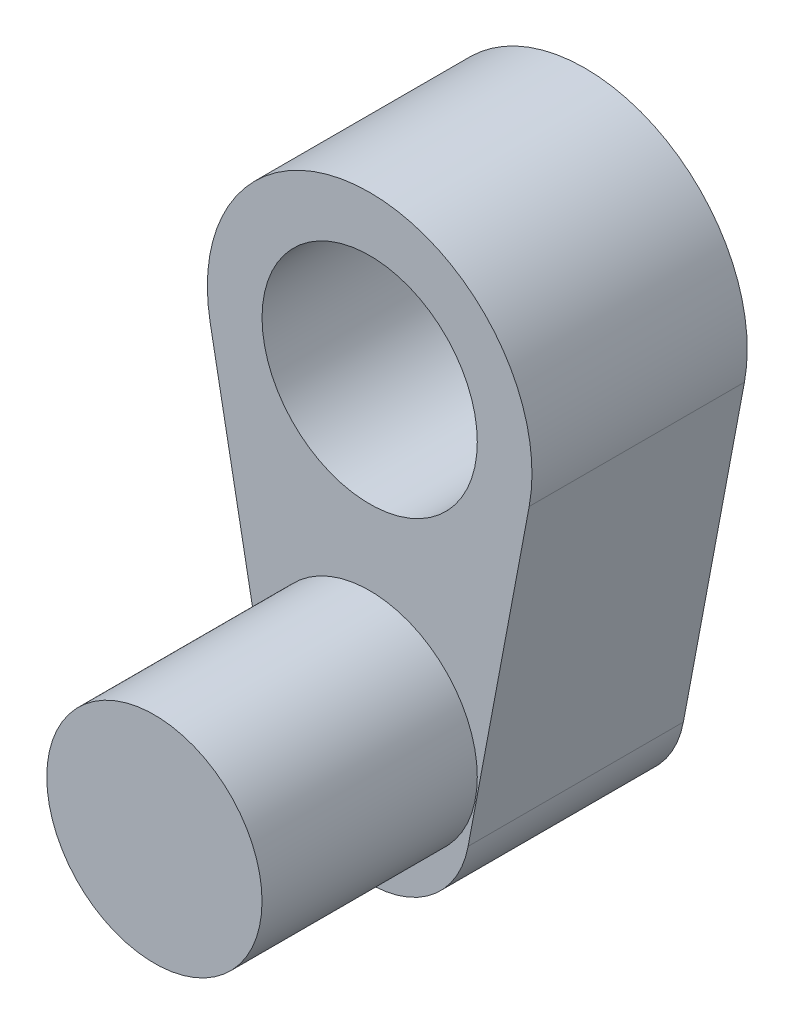
ISO-10303-21;
HEADER;
FILE_DESCRIPTION(('STEP AP214'),'2;1');
FILE_NAME('part.step','',(''),(''),'','','');
FILE_SCHEMA(('AUTOMOTIVE_DESIGN { 1 0 10303 214 1 1 1 1 }'));
ENDSEC;
DATA;
#1=APPLICATION_CONTEXT('core data for automotive mechanical design processes');
#2=APPLICATION_PROTOCOL_DEFINITION('international standard','automotive_design',2000,#1);
#3=PRODUCT_CONTEXT('',#1,'mechanical');
#4=PRODUCT('Part','Part','',(#3));
#5=PRODUCT_RELATED_PRODUCT_CATEGORY('part','',(#4));
#6=PRODUCT_DEFINITION_FORMATION('','',#4);
#7=PRODUCT_DEFINITION_CONTEXT('part definition',#1,'design');
#8=PRODUCT_DEFINITION('design','',#6,#7);
#9=PRODUCT_DEFINITION_SHAPE('','',#8);
#10=(LENGTH_UNIT() NAMED_UNIT(*) SI_UNIT(.MILLI.,.METRE.));
#11=(NAMED_UNIT(*) PLANE_ANGLE_UNIT() SI_UNIT($,.RADIAN.));
#12=(NAMED_UNIT(*) SI_UNIT($,.STERADIAN.) SOLID_ANGLE_UNIT());
#13=UNCERTAINTY_MEASURE_WITH_UNIT(LENGTH_MEASURE(1.E-05),#10,'distance_accuracy_value','');
#14=(GEOMETRIC_REPRESENTATION_CONTEXT(3) GLOBAL_UNCERTAINTY_ASSIGNED_CONTEXT((#13)) GLOBAL_UNIT_ASSIGNED_CONTEXT((#10,
#11,#12)) REPRESENTATION_CONTEXT('',''));
#15=CARTESIAN_POINT('',(0.,0.,0.));
#16=DIRECTION('',(0.,0.,1.));
#17=DIRECTION('',(1.,0.,0.));
#18=AXIS2_PLACEMENT_3D('',#15,#16,#17);
#19=CARTESIAN_POINT('',(0.,3.04949255686098,3.));
#20=DIRECTION('',(0.,0.,-1.));
#21=DIRECTION('',(-1.,0.,0.));
#22=AXIS2_PLACEMENT_3D('',#19,#20,#21);
#23=PLANE('',#22);
#24=CARTESIAN_POINT('',(0.,-0.994117185583221,3.));
#25=DIRECTION('',(0.,0.,-1.));
#26=DIRECTION('',(-1.,0.,0.));
#27=AXIS2_PLACEMENT_3D('',#24,#25,#26);
#28=CIRCLE('',#27,1.5);
#29=CARTESIAN_POINT('',(-1.5,-0.994117185583221,3.));
#30=VERTEX_POINT('',#29);
#31=EDGE_CURVE('E11',#30,#30,#28,.F.);
#32=ORIENTED_EDGE('',*,*,#31,.F.);
#33=EDGE_LOOP('',(#32));
#34=FACE_BOUND('',#33,.T.);
#35=CARTESIAN_POINT('',(0.,3.04949255686098,3.));
#36=DIRECTION('',(0.,0.,1.));
#37=DIRECTION('',(-1.,0.,0.));
#38=AXIS2_PLACEMENT_3D('',#35,#36,#37);
#39=CIRCLE('',#38,2.26199619422587);
#40=CARTESIAN_POINT('',(2.22305998324787,2.6316037037262,3.));
#41=VERTEX_POINT('',#40);
#42=CARTESIAN_POINT('',(-2.22305998324787,2.6316037037262,3.));
#43=VERTEX_POINT('',#42);
#44=EDGE_CURVE('E93',#41,#43,#39,.T.);
#45=ORIENTED_EDGE('',*,*,#44,.T.);
#46=DIRECTION('',(0.184743393557211,-0.982786792003721,0.));
#47=VECTOR('',#46,1.);
#48=CARTESIAN_POINT('',(-2.22305998324787,2.6316037037262,3.));
#49=LINE('',#48,#47);
#50=CARTESIAN_POINT('',(-1.37209001373719,-1.8953351508852,3.));
#51=VERTEX_POINT('',#50);
#52=EDGE_CURVE('E88',#43,#51,#49,.T.);
#53=ORIENTED_EDGE('',*,*,#52,.T.);
#54=CARTESIAN_POINT('',(0.,-1.63741088138321,3.));
#55=DIRECTION('',(0.,0.,1.));
#56=DIRECTION('',(1.,0.,0.));
#57=AXIS2_PLACEMENT_3D('',#54,#55,#56);
#58=CIRCLE('',#57,1.39612174776968);
#59=CARTESIAN_POINT('',(1.37209001373719,-1.8953351508852,3.));
#60=VERTEX_POINT('',#59);
#61=EDGE_CURVE('E91',#51,#60,#58,.T.);
#62=ORIENTED_EDGE('',*,*,#61,.T.);
#63=DIRECTION('',(0.184743393557211,0.982786792003721,0.));
#64=VECTOR('',#63,1.);
#65=CARTESIAN_POINT('',(2.22305998324787,2.6316037037262,3.));
#66=LINE('',#65,#64);
#67=EDGE_CURVE('E57',#60,#41,#66,.T.);
#68=ORIENTED_EDGE('',*,*,#67,.T.);
#69=EDGE_LOOP('',(#45,#53,#62,#68));
#70=FACE_BOUND('',#69,.T.);
#71=CARTESIAN_POINT('',(0.,3.04949255686098,3.));
#72=DIRECTION('',(0.,0.,1.));
#73=DIRECTION('',(1.,0.,0.));
#74=AXIS2_PLACEMENT_3D('',#71,#72,#73);
#75=CIRCLE('',#74,1.5);
#76=CARTESIAN_POINT('',(1.5,3.04949255686098,3.));
#77=VERTEX_POINT('',#76);
#78=EDGE_CURVE('E115',#77,#77,#75,.T.);
#79=ORIENTED_EDGE('',*,*,#78,.F.);
#80=EDGE_LOOP('',(#79));
#81=FACE_BOUND('',#80,.T.);
#82=ADVANCED_FACE('F39',(#34,#70,#81),#23,.F.);
#83=CARTESIAN_POINT('',(0.,3.04949255686098,0.));
#84=DIRECTION('',(0.,0.,-1.));
#85=DIRECTION('',(-1.,0.,0.));
#86=AXIS2_PLACEMENT_3D('',#83,#84,#85);
#87=PLANE('',#86);
#88=CARTESIAN_POINT('',(0.,3.04949255686098,0.));
#89=DIRECTION('',(0.,0.,1.));
#90=DIRECTION('',(-1.,0.,0.));
#91=AXIS2_PLACEMENT_3D('',#88,#89,#90);
#92=CIRCLE('',#91,2.26199619422587);
#93=CARTESIAN_POINT('',(2.22305998324787,2.6316037037262,0.));
#94=VERTEX_POINT('',#93);
#95=CARTESIAN_POINT('',(-2.22305998324787,2.6316037037262,0.));
#96=VERTEX_POINT('',#95);
#97=EDGE_CURVE('E111',#94,#96,#92,.T.);
#98=ORIENTED_EDGE('',*,*,#97,.F.);
#99=DIRECTION('',(0.184743393557211,0.982786792003721,0.));
#100=VECTOR('',#99,1.);
#101=CARTESIAN_POINT('',(2.22305998324787,2.6316037037262,0.));
#102=LINE('',#101,#100);
#103=CARTESIAN_POINT('',(1.37209001373719,-1.8953351508852,0.));
#104=VERTEX_POINT('',#103);
#105=EDGE_CURVE('E80',#104,#94,#102,.T.);
#106=ORIENTED_EDGE('',*,*,#105,.F.);
#107=CARTESIAN_POINT('',(0.,-1.63741088138321,0.));
#108=DIRECTION('',(0.,0.,1.));
#109=DIRECTION('',(1.,0.,0.));
#110=AXIS2_PLACEMENT_3D('',#107,#108,#109);
#111=CIRCLE('',#110,1.39612174776968);
#112=CARTESIAN_POINT('',(-1.37209001373719,-1.8953351508852,0.));
#113=VERTEX_POINT('',#112);
#114=EDGE_CURVE('E74',#113,#104,#111,.T.);
#115=ORIENTED_EDGE('',*,*,#114,.F.);
#116=DIRECTION('',(0.184743393557211,-0.982786792003721,0.));
#117=VECTOR('',#116,1.);
#118=CARTESIAN_POINT('',(-2.22305998324787,2.6316037037262,0.));
#119=LINE('',#118,#117);
#120=EDGE_CURVE('E99',#96,#113,#119,.T.);
#121=ORIENTED_EDGE('',*,*,#120,.F.);
#122=EDGE_LOOP('',(#98,#106,#115,#121));
#123=FACE_BOUND('',#122,.T.);
#124=CARTESIAN_POINT('',(0.,3.04949255686098,0.));
#125=DIRECTION('',(0.,0.,1.));
#126=DIRECTION('',(1.,0.,0.));
#127=AXIS2_PLACEMENT_3D('',#124,#125,#126);
#128=CIRCLE('',#127,1.5);
#129=CARTESIAN_POINT('',(1.5,3.04949255686098,0.));
#130=VERTEX_POINT('',#129);
#131=EDGE_CURVE('E135',#130,#130,#128,.T.);
#132=ORIENTED_EDGE('',*,*,#131,.T.);
#133=EDGE_LOOP('',(#132));
#134=FACE_BOUND('',#133,.T.);
#135=ADVANCED_FACE('F129',(#123,#134),#87,.T.);
#136=CARTESIAN_POINT('',(0.,3.04949255686098,3.));
#137=DIRECTION('',(0.,0.,-1.));
#138=DIRECTION('',(-1.,0.,0.));
#139=AXIS2_PLACEMENT_3D('',#136,#137,#138);
#140=CYLINDRICAL_SURFACE('',#139,2.26199619422587);
#141=ORIENTED_EDGE('',*,*,#97,.T.);
#142=DIRECTION('',(0.,0.,-1.));
#143=VECTOR('',#142,1.);
#144=CARTESIAN_POINT('',(-2.22305998324787,2.6316037037262,3.));
#145=LINE('',#144,#143);
#146=EDGE_CURVE('E49',#43,#96,#145,.T.);
#147=ORIENTED_EDGE('',*,*,#146,.F.);
#148=ORIENTED_EDGE('',*,*,#44,.F.);
#149=DIRECTION('',(0.,0.,-1.));
#150=VECTOR('',#149,1.);
#151=CARTESIAN_POINT('',(2.22305998324787,2.6316037037262,3.));
#152=LINE('',#151,#150);
#153=EDGE_CURVE('E107',#41,#94,#152,.T.);
#154=ORIENTED_EDGE('',*,*,#153,.T.);
#155=EDGE_LOOP('',(#141,#147,#148,#154));
#156=FACE_BOUND('',#155,.T.);
#157=ADVANCED_FACE('F41',(#156),#140,.T.);
#158=CARTESIAN_POINT('',(-2.22305998324787,2.6316037037262,3.));
#159=DIRECTION('',(0.982786792003721,0.184743393557211,0.));
#160=DIRECTION('',(-0.184743393557211,0.982786792003721,0.));
#161=AXIS2_PLACEMENT_3D('',#158,#159,#160);
#162=PLANE('',#161);
#163=ORIENTED_EDGE('',*,*,#120,.T.);
#164=DIRECTION('',(0.,0.,-1.));
#165=VECTOR('',#164,1.);
#166=CARTESIAN_POINT('',(-1.37209001373719,-1.8953351508852,3.));
#167=LINE('',#166,#165);
#168=EDGE_CURVE('E97',#51,#113,#167,.T.);
#169=ORIENTED_EDGE('',*,*,#168,.F.);
#170=ORIENTED_EDGE('',*,*,#52,.F.);
#171=ORIENTED_EDGE('',*,*,#146,.T.);
#172=EDGE_LOOP('',(#163,#169,#170,#171));
#173=FACE_BOUND('',#172,.T.);
#174=ADVANCED_FACE('F98',(#173),#162,.F.);
#175=CARTESIAN_POINT('',(0.,-1.63741088138321,3.));
#176=DIRECTION('',(0.,0.,-1.));
#177=DIRECTION('',(-1.,0.,0.));
#178=AXIS2_PLACEMENT_3D('',#175,#176,#177);
#179=CYLINDRICAL_SURFACE('',#178,1.39612174776968);
#180=ORIENTED_EDGE('',*,*,#114,.T.);
#181=DIRECTION('',(0.,0.,-1.));
#182=VECTOR('',#181,1.);
#183=CARTESIAN_POINT('',(1.37209001373719,-1.8953351508852,3.));
#184=LINE('',#183,#182);
#185=EDGE_CURVE('E101',#60,#104,#184,.T.);
#186=ORIENTED_EDGE('',*,*,#185,.F.);
#187=ORIENTED_EDGE('',*,*,#61,.F.);
#188=ORIENTED_EDGE('',*,*,#168,.T.);
#189=EDGE_LOOP('',(#180,#186,#187,#188));
#190=FACE_BOUND('',#189,.T.);
#191=ADVANCED_FACE('F103',(#190),#179,.T.);
#192=CARTESIAN_POINT('',(2.22305998324787,2.6316037037262,3.));
#193=DIRECTION('',(-0.982786792003721,0.184743393557211,0.));
#194=DIRECTION('',(-0.184743393557211,-0.982786792003721,0.));
#195=AXIS2_PLACEMENT_3D('',#192,#193,#194);
#196=PLANE('',#195);
#197=ORIENTED_EDGE('',*,*,#105,.T.);
#198=ORIENTED_EDGE('',*,*,#153,.F.);
#199=ORIENTED_EDGE('',*,*,#67,.F.);
#200=ORIENTED_EDGE('',*,*,#185,.T.);
#201=EDGE_LOOP('',(#197,#198,#199,#200));
#202=FACE_BOUND('',#201,.T.);
#203=ADVANCED_FACE('F164',(#202),#196,.F.);
#204=CARTESIAN_POINT('',(0.,3.04949255686098,3.));
#205=DIRECTION('',(0.,0.,-1.));
#206=DIRECTION('',(-1.,0.,0.));
#207=AXIS2_PLACEMENT_3D('',#204,#205,#206);
#208=CYLINDRICAL_SURFACE('',#207,1.5);
#209=ORIENTED_EDGE('',*,*,#78,.T.);
#210=EDGE_LOOP('',(#209));
#211=FACE_BOUND('',#210,.T.);
#212=ORIENTED_EDGE('',*,*,#131,.F.);
#213=EDGE_LOOP('',(#212));
#214=FACE_BOUND('',#213,.T.);
#215=ADVANCED_FACE('F154',(#211,#214),#208,.F.);
#216=CARTESIAN_POINT('',(0.,-0.994117185583221,6.));
#217=DIRECTION('',(0.,0.,-1.));
#218=DIRECTION('',(-1.,0.,0.));
#219=AXIS2_PLACEMENT_3D('',#216,#217,#218);
#220=CYLINDRICAL_SURFACE('',#219,1.5);
#221=CARTESIAN_POINT('',(0.,-0.994117185583221,6.));
#222=DIRECTION('',(0.,0.,1.));
#223=DIRECTION('',(1.,0.,0.));
#224=AXIS2_PLACEMENT_3D('',#221,#222,#223);
#225=CIRCLE('',#224,1.5);
#226=CARTESIAN_POINT('',(1.5,-0.994117185583221,6.));
#227=VERTEX_POINT('',#226);
#228=EDGE_CURVE('E138',#227,#227,#225,.T.);
#229=ORIENTED_EDGE('',*,*,#228,.F.);
#230=EDGE_LOOP('',(#229));
#231=FACE_BOUND('',#230,.T.);
#232=ORIENTED_EDGE('',*,*,#31,.T.);
#233=EDGE_LOOP('',(#232));
#234=FACE_BOUND('',#233,.T.);
#235=ADVANCED_FACE('F151',(#231,#234),#220,.T.);
#236=CARTESIAN_POINT('',(0.,-0.994117185583221,6.));
#237=DIRECTION('',(0.,0.,1.));
#238=DIRECTION('',(1.,0.,0.));
#239=AXIS2_PLACEMENT_3D('',#236,#237,#238);
#240=PLANE('',#239);
#241=ORIENTED_EDGE('',*,*,#228,.T.);
#242=EDGE_LOOP('',(#241));
#243=FACE_BOUND('',#242,.T.);
#244=ADVANCED_FACE('F149',(#243),#240,.T.);
#245=CLOSED_SHELL('',(#82,#135,#157,#174,#191,#203,#215,#235,#244));
#246=MANIFOLD_SOLID_BREP('B2',#245);
#247=ADVANCED_BREP_SHAPE_REPRESENTATION('',(#18,#246),#14);
#248=SHAPE_DEFINITION_REPRESENTATION(#9,#247);
ENDSEC;
END-ISO-10303-21;
